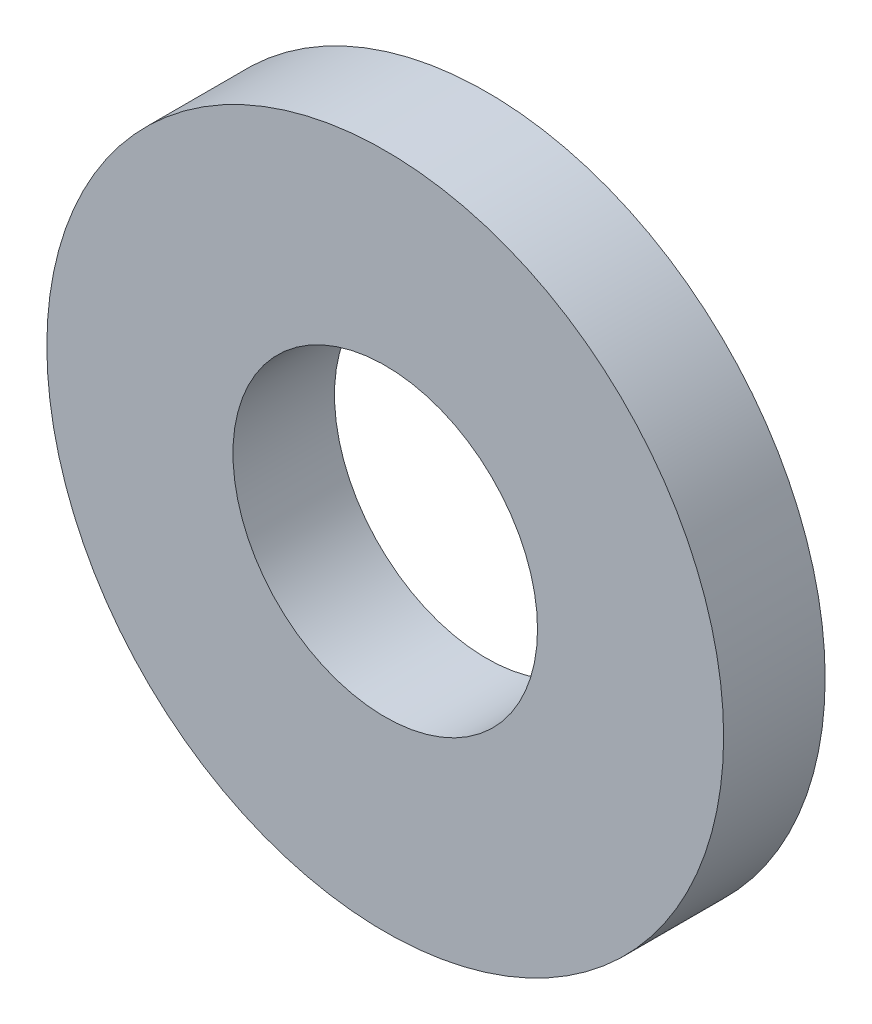
ISO-10303-21;
HEADER;
FILE_DESCRIPTION(('STEP AP214'),'2;1');
FILE_NAME('part.step','',(''),(''),'','','');
FILE_SCHEMA(('AUTOMOTIVE_DESIGN { 1 0 10303 214 1 1 1 1 }'));
ENDSEC;
DATA;
#1=APPLICATION_CONTEXT('core data for automotive mechanical design processes');
#2=APPLICATION_PROTOCOL_DEFINITION('international standard','automotive_design',2000,#1);
#3=PRODUCT_CONTEXT('',#1,'mechanical');
#4=PRODUCT('Part','Part','',(#3));
#5=PRODUCT_RELATED_PRODUCT_CATEGORY('part','',(#4));
#6=PRODUCT_DEFINITION_FORMATION('','',#4);
#7=PRODUCT_DEFINITION_CONTEXT('part definition',#1,'design');
#8=PRODUCT_DEFINITION('design','',#6,#7);
#9=PRODUCT_DEFINITION_SHAPE('','',#8);
#10=(LENGTH_UNIT() NAMED_UNIT(*) SI_UNIT(.MILLI.,.METRE.));
#11=(NAMED_UNIT(*) PLANE_ANGLE_UNIT() SI_UNIT($,.RADIAN.));
#12=(NAMED_UNIT(*) SI_UNIT($,.STERADIAN.) SOLID_ANGLE_UNIT());
#13=UNCERTAINTY_MEASURE_WITH_UNIT(LENGTH_MEASURE(1.E-05),#10,'distance_accuracy_value','');
#14=(GEOMETRIC_REPRESENTATION_CONTEXT(3) GLOBAL_UNCERTAINTY_ASSIGNED_CONTEXT((#13)) GLOBAL_UNIT_ASSIGNED_CONTEXT((#10,
#11,#12)) REPRESENTATION_CONTEXT('',''));
#15=CARTESIAN_POINT('',(0.,0.,0.));
#16=DIRECTION('',(0.,0.,1.));
#17=DIRECTION('',(1.,0.,0.));
#18=AXIS2_PLACEMENT_3D('',#15,#16,#17);
#19=CARTESIAN_POINT('',(0.,0.,1.5));
#20=DIRECTION('',(0.,0.,1.));
#21=DIRECTION('',(1.,0.,0.));
#22=AXIS2_PLACEMENT_3D('',#19,#20,#21);
#23=PLANE('',#22);
#24=CARTESIAN_POINT('',(0.,0.,1.5));
#25=DIRECTION('',(0.,0.,1.));
#26=DIRECTION('',(1.,0.,0.));
#27=AXIS2_PLACEMENT_3D('',#24,#25,#26);
#28=CIRCLE('',#27,5.);
#29=CARTESIAN_POINT('',(5.,0.,1.5));
#30=VERTEX_POINT('',#29);
#31=EDGE_CURVE('E10',#30,#30,#28,.T.);
#32=ORIENTED_EDGE('',*,*,#31,.T.);
#33=EDGE_LOOP('',(#32));
#34=FACE_BOUND('',#33,.T.);
#35=CARTESIAN_POINT('',(0.,0.,1.5));
#36=DIRECTION('',(0.,0.,1.));
#37=DIRECTION('',(1.,0.,0.));
#38=AXIS2_PLACEMENT_3D('',#35,#36,#37);
#39=CIRCLE('',#38,2.25);
#40=CARTESIAN_POINT('',(2.25,0.,1.5));
#41=VERTEX_POINT('',#40);
#42=EDGE_CURVE('E54',#41,#41,#39,.T.);
#43=ORIENTED_EDGE('',*,*,#42,.F.);
#44=EDGE_LOOP('',(#43));
#45=FACE_BOUND('',#44,.T.);
#46=ADVANCED_FACE('F41',(#34,#45),#23,.T.);
#47=CARTESIAN_POINT('',(0.,0.,0.));
#48=DIRECTION('',(0.,0.,1.));
#49=DIRECTION('',(1.,0.,0.));
#50=AXIS2_PLACEMENT_3D('',#47,#48,#49);
#51=PLANE('',#50);
#52=CARTESIAN_POINT('',(0.,0.,0.));
#53=DIRECTION('',(0.,0.,1.));
#54=DIRECTION('',(1.,0.,0.));
#55=AXIS2_PLACEMENT_3D('',#52,#53,#54);
#56=CIRCLE('',#55,5.);
#57=CARTESIAN_POINT('',(5.,0.,0.));
#58=VERTEX_POINT('',#57);
#59=EDGE_CURVE('E45',#58,#58,#56,.T.);
#60=ORIENTED_EDGE('',*,*,#59,.F.);
#61=EDGE_LOOP('',(#60));
#62=FACE_BOUND('',#61,.T.);
#63=CARTESIAN_POINT('',(0.,0.,0.));
#64=DIRECTION('',(0.,0.,1.));
#65=DIRECTION('',(1.,0.,0.));
#66=AXIS2_PLACEMENT_3D('',#63,#64,#65);
#67=CIRCLE('',#66,2.25);
#68=CARTESIAN_POINT('',(2.25,0.,0.));
#69=VERTEX_POINT('',#68);
#70=EDGE_CURVE('E56',#69,#69,#67,.T.);
#71=ORIENTED_EDGE('',*,*,#70,.T.);
#72=EDGE_LOOP('',(#71));
#73=FACE_BOUND('',#72,.T.);
#74=ADVANCED_FACE('F68',(#62,#73),#51,.F.);
#75=CARTESIAN_POINT('',(0.,0.,1.5));
#76=DIRECTION('',(0.,0.,-1.));
#77=DIRECTION('',(-1.,0.,0.));
#78=AXIS2_PLACEMENT_3D('',#75,#76,#77);
#79=CYLINDRICAL_SURFACE('',#78,5.);
#80=ORIENTED_EDGE('',*,*,#31,.F.);
#81=EDGE_LOOP('',(#80));
#82=FACE_BOUND('',#81,.T.);
#83=ORIENTED_EDGE('',*,*,#59,.T.);
#84=EDGE_LOOP('',(#83));
#85=FACE_BOUND('',#84,.T.);
#86=ADVANCED_FACE('F43',(#82,#85),#79,.T.);
#87=CARTESIAN_POINT('',(0.,0.,1.5));
#88=DIRECTION('',(0.,0.,-1.));
#89=DIRECTION('',(-1.,0.,0.));
#90=AXIS2_PLACEMENT_3D('',#87,#88,#89);
#91=CYLINDRICAL_SURFACE('',#90,2.25);
#92=ORIENTED_EDGE('',*,*,#42,.T.);
#93=EDGE_LOOP('',(#92));
#94=FACE_BOUND('',#93,.T.);
#95=ORIENTED_EDGE('',*,*,#70,.F.);
#96=EDGE_LOOP('',(#95));
#97=FACE_BOUND('',#96,.T.);
#98=ADVANCED_FACE('F64',(#94,#97),#91,.F.);
#99=CLOSED_SHELL('',(#46,#74,#86,#98));
#100=MANIFOLD_SOLID_BREP('B2',#99);
#101=ADVANCED_BREP_SHAPE_REPRESENTATION('',(#18,#100),#14);
#102=SHAPE_DEFINITION_REPRESENTATION(#9,#101);
ENDSEC;
END-ISO-10303-21;
